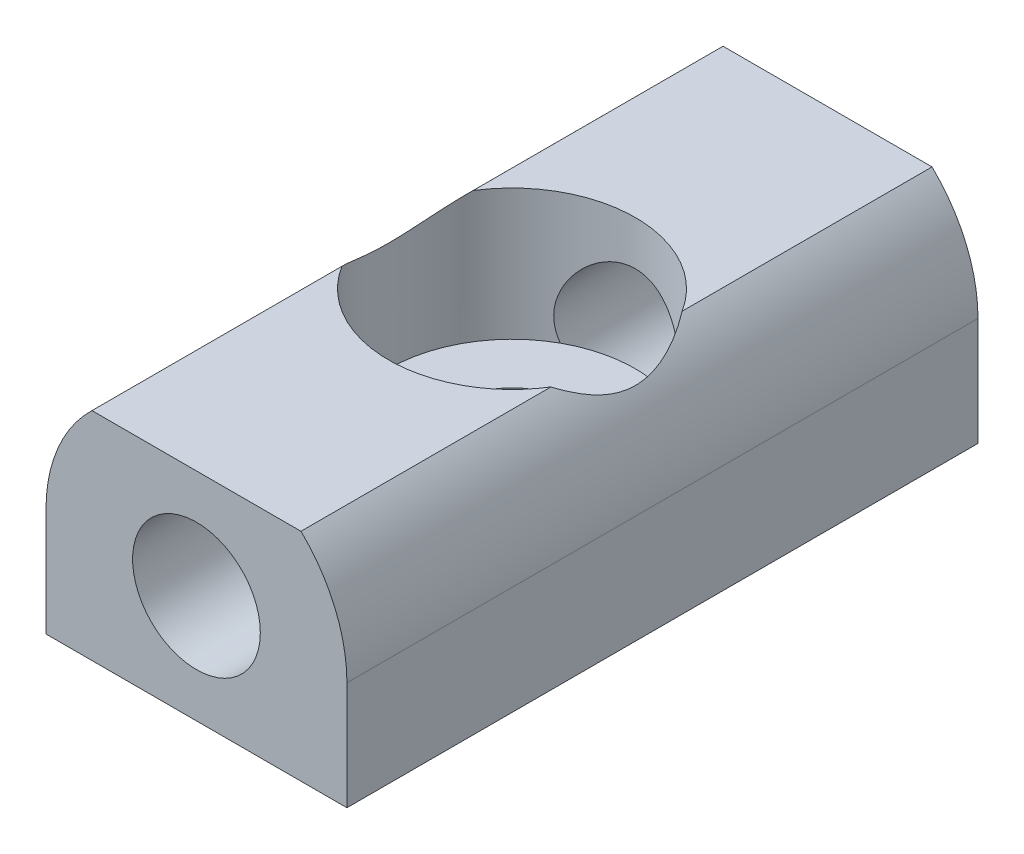
ISO-10303-21;
HEADER;
FILE_DESCRIPTION(('STEP AP214'),'2;1');
FILE_NAME('part.step','',(''),(''),'','','');
FILE_SCHEMA(('AUTOMOTIVE_DESIGN { 1 0 10303 214 1 1 1 1 }'));
ENDSEC;
DATA;
#1=APPLICATION_CONTEXT('core data for automotive mechanical design processes');
#2=APPLICATION_PROTOCOL_DEFINITION('international standard','automotive_design',2000,#1);
#3=PRODUCT_CONTEXT('',#1,'mechanical');
#4=PRODUCT('Part','Part','',(#3));
#5=PRODUCT_RELATED_PRODUCT_CATEGORY('part','',(#4));
#6=PRODUCT_DEFINITION_FORMATION('','',#4);
#7=PRODUCT_DEFINITION_CONTEXT('part definition',#1,'design');
#8=PRODUCT_DEFINITION('design','',#6,#7);
#9=PRODUCT_DEFINITION_SHAPE('','',#8);
#10=(LENGTH_UNIT() NAMED_UNIT(*) SI_UNIT(.MILLI.,.METRE.));
#11=(NAMED_UNIT(*) PLANE_ANGLE_UNIT() SI_UNIT($,.RADIAN.));
#12=(NAMED_UNIT(*) SI_UNIT($,.STERADIAN.) SOLID_ANGLE_UNIT());
#13=UNCERTAINTY_MEASURE_WITH_UNIT(LENGTH_MEASURE(1.E-05),#10,'distance_accuracy_value','');
#14=(GEOMETRIC_REPRESENTATION_CONTEXT(3) GLOBAL_UNCERTAINTY_ASSIGNED_CONTEXT((#13)) GLOBAL_UNIT_ASSIGNED_CONTEXT((#10,
#11,#12)) REPRESENTATION_CONTEXT('',''));
#15=CARTESIAN_POINT('',(0.,0.,0.));
#16=DIRECTION('',(0.,0.,1.));
#17=DIRECTION('',(1.,0.,0.));
#18=AXIS2_PLACEMENT_3D('',#15,#16,#17);
#19=CARTESIAN_POINT('',(0.,0.,14.575));
#20=DIRECTION('',(0.,0.,-1.));
#21=DIRECTION('',(-1.,0.,0.));
#22=AXIS2_PLACEMENT_3D('',#19,#20,#21);
#23=CYLINDRICAL_SURFACE('',#22,3.475);
#24=CARTESIAN_POINT('',(0.,0.,14.575));
#25=DIRECTION('',(0.,0.,1.));
#26=DIRECTION('',(1.,0.,0.));
#27=AXIS2_PLACEMENT_3D('',#24,#25,#26);
#28=CIRCLE('',#27,3.475);
#29=CARTESIAN_POINT('',(-2.41363315356746,2.5,14.575));
#30=VERTEX_POINT('',#29);
#31=CARTESIAN_POINT('',(-3.475,0.,14.575));
#32=VERTEX_POINT('',#31);
#33=EDGE_CURVE('E78',#30,#32,#28,.T.);
#34=ORIENTED_EDGE('',*,*,#33,.F.);
#35=DIRECTION('',(0.,0.,1.));
#36=VECTOR('',#35,1.);
#37=CARTESIAN_POINT('',(-2.41363315356746,2.5,0.));
#38=LINE('',#37,#36);
#39=CARTESIAN_POINT('',(-2.41363315356746,2.5,8.80304445662276));
#40=VERTEX_POINT('',#39);
#41=EDGE_CURVE('E86',#40,#30,#38,.T.);
#42=ORIENTED_EDGE('',*,*,#41,.F.);
#43=CARTESIAN_POINT('',(-2.43926218353009,2.475,8.76144029729837));
#44=CARTESIAN_POINT('',(-2.50190977369035,2.41324889261501,8.65777444071776));
#45=CARTESIAN_POINT('',(-2.55838255304536,2.35287213836801,8.5494403876258));
#46=CARTESIAN_POINT('',(-2.65815392253275,2.23953977548664,8.32289441469275));
#47=CARTESIAN_POINT('',(-2.70144008623445,2.18659119198941,8.20467331063059));
#48=CARTESIAN_POINT('',(-2.76475087189437,2.10565978747241,7.98637950962617));
#49=CARTESIAN_POINT('',(-2.78782953942763,2.07473711270727,7.88832070854308));
#50=CARTESIAN_POINT('',(-2.82364300092687,2.025735520454,7.68736716443351));
#51=CARTESIAN_POINT('',(-2.83640973198725,2.00761696929584,7.58448840474494));
#52=CARTESIAN_POINT('',(-2.85058409003645,1.98745522065405,7.37535119418737));
#53=CARTESIAN_POINT('',(-2.85188988965693,1.98555613283829,7.26907085056291));
#54=CARTESIAN_POINT('',(-2.84271445963148,1.9986603815719,7.05797465274123));
#55=CARTESIAN_POINT('',(-2.83221238178918,2.01369361420743,6.95316172070022));
#56=CARTESIAN_POINT('',(-2.79761719439963,2.06154034529333,6.73000059681824));
#57=CARTESIAN_POINT('',(-2.77142719380401,2.09705557991804,6.61258935308574));
#58=CARTESIAN_POINT('',(-2.70628208954812,2.18046717610668,6.38611715259161));
#59=CARTESIAN_POINT('',(-2.66730873016388,2.22838122345369,6.27706841460803));
#60=CARTESIAN_POINT('',(-2.59604436977691,2.31037835437774,6.10950037214036));
#61=CARTESIAN_POINT('',(-2.56736862173828,2.34227506792739,6.04829593642552));
#62=CARTESIAN_POINT('',(-2.50617327417022,2.40763784152143,5.9287870834782));
#63=CARTESIAN_POINT('',(-2.47365680258223,2.44110261129793,5.87048036054944));
#64=CARTESIAN_POINT('',(-2.39486151680196,2.51875878262914,5.74007974482753));
#65=CARTESIAN_POINT('',(-2.34733097023837,2.56323851250945,5.66890962536082));
#66=CARTESIAN_POINT('',(-2.24613569636115,2.65236921845846,5.53117348856127));
#67=CARTESIAN_POINT('',(-2.19246772004118,2.69702027302246,5.46460994004165));
#68=CARTESIAN_POINT('',(-2.02210595995551,2.82973263718651,5.27180323333249));
#69=CARTESIAN_POINT('',(-1.89612041633756,2.9164847417045,5.15255348261589));
#70=CARTESIAN_POINT('',(-1.64684453783638,3.06271532527436,4.95718473213086));
#71=CARTESIAN_POINT('',(-1.52776733977672,3.1242206566162,4.87718607247437));
#72=CARTESIAN_POINT('',(-1.27485928373556,3.23563660417618,4.73441949093708));
#73=CARTESIAN_POINT('',(-1.14105921752199,3.28557076556997,4.67161653084711));
#74=CARTESIAN_POINT('',(-0.883233161936728,3.36313393376537,4.5748937652111));
#75=CARTESIAN_POINT('',(-0.761026896837387,3.39304534428192,4.53797165891381));
#76=CARTESIAN_POINT('',(-0.510337205420337,3.43967983328066,4.4806236268406));
#77=CARTESIAN_POINT('',(-0.381856479799465,3.45640853374033,4.46019066891417));
#78=CARTESIAN_POINT('',(-0.121813978926077,3.47531680621844,4.43710590515606));
#79=CARTESIAN_POINT('',(0.00975610081333341,3.47745119255279,4.43450932269117));
#80=CARTESIAN_POINT('',(0.271382863806724,3.46686021199457,4.44742815498595));
#81=CARTESIAN_POINT('',(0.40143953205286,3.45413469786945,4.46294374920187));
#82=CARTESIAN_POINT('',(0.650016058262371,3.41587090100423,4.50987117322859));
#83=CARTESIAN_POINT('',(0.768790091574681,3.39097607006356,4.54048532678091));
#84=CARTESIAN_POINT('',(0.998971313482863,3.33044637203088,4.61556462346527));
#85=CARTESIAN_POINT('',(1.11037414022907,3.2948052139872,4.66003788029607));
#86=CARTESIAN_POINT('',(1.36159700816191,3.20084259195604,4.77871208170644));
#87=CARTESIAN_POINT('',(1.49773929795144,3.13894801350803,4.85787038736546));
#88=CARTESIAN_POINT('',(1.75186640593188,3.00454959782697,5.03417510034775));
#89=CARTESIAN_POINT('',(1.86982987629211,2.93203347937408,5.1313423656256));
#90=CARTESIAN_POINT('',(2.06797508201246,2.79480966075599,5.32244443375192));
#91=CARTESIAN_POINT('',(2.15115285802495,2.73097160112958,5.41394238267963));
#92=CARTESIAN_POINT('',(2.30479613120814,2.60260305764272,5.60655081561428));
#93=CARTESIAN_POINT('',(2.37526695235252,2.53807287583134,5.70765724660778));
#94=CARTESIAN_POINT('',(2.50197011384549,2.41319587132285,5.91733187001413));
#95=CARTESIAN_POINT('',(2.55846035436421,2.35279100920971,6.02570905346938));
#96=CARTESIAN_POINT('',(2.65820388496736,2.2394757762435,6.25224627455069));
#97=CARTESIAN_POINT('',(2.70146165682581,2.18656287116897,6.3704029826326));
#98=CARTESIAN_POINT('',(2.76474768827562,2.10566443377195,6.58860803188994));
#99=CARTESIAN_POINT('',(2.78782284158078,2.07474625164119,6.686650180331));
#100=CARTESIAN_POINT('',(2.82363887267227,2.02574119966392,6.88760125547145));
#101=CARTESIAN_POINT('',(2.83640859678508,2.0076185313392,6.9904957380986));
#102=CARTESIAN_POINT('',(2.85058461390827,1.98745452863603,7.19965563518298));
#103=CARTESIAN_POINT('',(2.85189006138037,1.98555591309574,7.30594272662161));
#104=CARTESIAN_POINT('',(2.84271311652689,1.99866227616743,7.51703864723879));
#105=CARTESIAN_POINT('',(2.83221137147234,2.01369500638849,7.62184476353867));
#106=CARTESIAN_POINT('',(2.79761988165825,2.06153663474359,7.8449821074913));
#107=CARTESIAN_POINT('',(2.77143470426432,2.09704538340722,7.96237704991149));
#108=CARTESIAN_POINT('',(2.70629329943093,2.18045339796158,8.18885140171435));
#109=CARTESIAN_POINT('',(2.66731516782178,2.22837388542062,8.29791615046933));
#110=CARTESIAN_POINT('',(2.59603239028864,2.31039209667104,8.46552797395679));
#111=CARTESIAN_POINT('',(2.567342840631,2.34230361538876,8.52675963888281));
#112=CARTESIAN_POINT('',(2.50614414942512,2.40766794041688,8.64626456696464));
#113=CARTESIAN_POINT('',(2.47364160109134,2.44111802715571,8.70454269437488));
#114=CARTESIAN_POINT('',(2.38246272344418,2.53097761395384,8.85544285334748));
#115=CARTESIAN_POINT('',(2.32054025105136,2.5881340835259,8.94567719590995));
#116=CARTESIAN_POINT('',(2.18651000179875,2.70232885743038,9.118806730169));
#117=CARTESIAN_POINT('',(2.11437511708981,2.75936642349007,9.20168140151638));
#118=CARTESIAN_POINT('',(1.97562302848502,2.85977762647954,9.34350878328268));
#119=CARTESIAN_POINT('',(1.91081322173801,2.90359249793913,9.40392073587042));
#120=CARTESIAN_POINT('',(1.774810205097,2.9886634331041,9.51920299243103));
#121=CARTESIAN_POINT('',(1.70361456007673,3.02991851044501,9.57407116527621));
#122=CARTESIAN_POINT('',(1.55509300607381,3.10875602312479,9.67755422450952));
#123=CARTESIAN_POINT('',(1.47777717122995,3.14634427553783,9.72617905544766));
#124=CARTESIAN_POINT('',(1.31725872639317,3.21685258815256,9.81649387341243));
#125=CARTESIAN_POINT('',(1.23405978812885,3.24977552216489,9.8581881323968));
#126=CARTESIAN_POINT('',(1.03194985948451,3.3205140942982,9.94713438309219));
#127=CARTESIAN_POINT('',(0.910760964149313,3.35598545051211,9.99119322921115));
#128=CARTESIAN_POINT('',(0.66074247294285,3.41401285029263,10.0628921864326));
#129=CARTESIAN_POINT('',(0.531920975405038,3.43658232146514,10.0905493686531));
#130=CARTESIAN_POINT('',(0.26932010065855,3.4670770642961,10.1278550061326));
#131=CARTESIAN_POINT('',(0.135520623651892,3.47493441862536,10.1374199420222));
#132=CARTESIAN_POINT('',(-0.132108190582186,3.4750647436083,10.1375790364937));
#133=CARTESIAN_POINT('',(-0.265937528611949,3.46733722733269,10.1281726023394));
#134=CARTESIAN_POINT('',(-0.520184225982676,3.43806577797489,10.0923647324905));
#135=CARTESIAN_POINT('',(-0.640892016746536,3.41750551949016,10.0671728093454));
#136=CARTESIAN_POINT('',(-0.875714733204624,3.36500168426022,10.0023611989993));
#137=CARTESIAN_POINT('',(-0.98982901570779,3.33305699914533,9.96274010698914));
#138=CARTESIAN_POINT('',(-1.21800863704809,3.25693795445332,9.86730874131388));
#139=CARTESIAN_POINT('',(-1.33139499143839,3.2120118778488,9.81048759770566));
#140=CARTESIAN_POINT('',(-1.54709584116062,3.11387071500706,9.68429802580414));
#141=CARTESIAN_POINT('',(-1.64939832058774,3.06064678258239,9.61491619392362));
#142=CARTESIAN_POINT('',(-1.86185287877644,2.93719653522217,9.45026539112624));
#143=CARTESIAN_POINT('',(-1.96940368730195,2.86570917922417,9.35259908581232));
#144=CARTESIAN_POINT('',(-2.16728345559199,2.71912023627006,9.14385720629286));
#145=CARTESIAN_POINT('',(-2.25763565602588,2.64402370091396,9.0328000637805));
#146=CARTESIAN_POINT('',(-2.37421574823566,2.5379067615074,8.86525672338763));
#147=CARTESIAN_POINT('',(-2.40753102357641,2.50627708920228,8.81394731103153));
#148=CARTESIAN_POINT('',(-2.43926218353009,2.475,8.76144029729837));
#149=B_SPLINE_CURVE_WITH_KNOTS('',3,(#43,#44,#45,#46,#47,#48,#49,#50,#51,#52,#53,#54,#55,#56,
#57,#58,#59,#60,#61,#62,#63,#64,#65,#66,#67,#68,#69,#70,#71,#72,#73,#74,#75,#76,#77,#78,#79,#80,
#81,#82,#83,#84,#85,#86,#87,#88,#89,#90,#91,#92,#93,#94,#95,#96,#97,#98,#99,#100,#101,#102,#103,
#104,#105,#106,#107,#108,#109,#110,#111,#112,#113,#114,#115,#116,#117,#118,#119,#120,#121,#122,
#123,#124,#125,#126,#127,#128,#129,#130,#131,#132,#133,#134,#135,#136,#137,#138,#139,#140,#141,
#142,#143,#144,#145,#146,#147,#148),.UNSPECIFIED.,.T.,.F.,(4,2,2,2,2,2,2,2,2,2,2,2,2,2,2,2,2,2,
2,2,2,2,2,2,2,2,2,2,2,2,2,2,2,2,2,2,2,2,2,2,2,2,2,2,2,2,2,2,2,2,2,2,4),(0.,0.407775414914111,
0.81593391743985,1.13096239142153,1.44501140892037,1.76184787547162,2.07924463375666,
2.45347457213725,2.82824128665926,3.05230146950828,3.2761804165901,3.56518999979718,
3.85435329213408,4.43311027500073,4.89965840516277,5.36524869314449,5.75693523197842,
6.14845463928973,6.54118568926538,6.93392063047069,7.30782894054741,7.6819565647389,
8.18685453785142,8.6923409794764,9.10892852340505,9.5253411173996,9.93337733269517,
10.3412751946614,10.65625630361,10.9703526485073,11.2872092046842,11.6045858667208,
11.9787622017012,12.3535825752655,12.5777431597902,12.8015216987775,13.1712341923253,
13.5419471218228,13.8381131408763,14.1343925816835,14.430194087024,14.725812580709,
15.1252820770723,15.5243350660447,15.9252257526493,16.3261289647632,16.6995436095788,
17.0729946193866,17.4751723564847,17.8777818170745,18.3618689991487,18.845297311351,
19.0518365714042),.UNSPECIFIED.);
#150=CARTESIAN_POINT('',(-2.41363315356746,2.5,5.77195554337723));
#151=VERTEX_POINT('',#150);
#152=EDGE_CURVE('E163',#40,#151,#149,.T.);
#153=ORIENTED_EDGE('',*,*,#152,.T.);
#154=CARTESIAN_POINT('',(-2.41363315356746,2.5,0.));
#155=VERTEX_POINT('',#154);
#156=EDGE_CURVE('E148',#155,#151,#38,.T.);
#157=ORIENTED_EDGE('',*,*,#156,.F.);
#158=CARTESIAN_POINT('',(0.,0.,0.));
#159=DIRECTION('',(0.,0.,1.));
#160=DIRECTION('',(1.,0.,0.));
#161=AXIS2_PLACEMENT_3D('',#158,#159,#160);
#162=CIRCLE('',#161,3.475);
#163=CARTESIAN_POINT('',(-3.475,0.,0.));
#164=VERTEX_POINT('',#163);
#165=EDGE_CURVE('E160',#155,#164,#162,.T.);
#166=ORIENTED_EDGE('',*,*,#165,.T.);
#167=DIRECTION('',(0.,0.,-1.));
#168=VECTOR('',#167,1.);
#169=CARTESIAN_POINT('',(-3.475,0.,19.4893921292465));
#170=LINE('',#169,#168);
#171=EDGE_CURVE('E201',#32,#164,#170,.T.);
#172=ORIENTED_EDGE('',*,*,#171,.F.);
#173=EDGE_LOOP('',(#34,#42,#153,#157,#166,#172));
#174=FACE_BOUND('',#173,.T.);
#175=ADVANCED_FACE('F67',(#174),#23,.T.);
#176=CARTESIAN_POINT('',(0.,0.,14.575));
#177=DIRECTION('',(0.,0.,1.));
#178=DIRECTION('',(1.,0.,0.));
#179=AXIS2_PLACEMENT_3D('',#176,#177,#178);
#180=PLANE('',#179);
#181=DIRECTION('',(1.,0.,0.));
#182=VECTOR('',#181,1.);
#183=CARTESIAN_POINT('',(0.,2.5,14.575));
#184=LINE('',#183,#182);
#185=CARTESIAN_POINT('',(2.41363315356746,2.5,14.575));
#186=VERTEX_POINT('',#185);
#187=EDGE_CURVE('E154',#30,#186,#184,.T.);
#188=ORIENTED_EDGE('',*,*,#187,.F.);
#189=ORIENTED_EDGE('',*,*,#33,.T.);
#190=DIRECTION('',(0.,-1.,0.));
#191=VECTOR('',#190,1.);
#192=CARTESIAN_POINT('',(-3.475,0.,14.575));
#193=LINE('',#192,#191);
#194=CARTESIAN_POINT('',(-3.475,-2.5,14.575));
#195=VERTEX_POINT('',#194);
#196=EDGE_CURVE('E198',#32,#195,#193,.T.);
#197=ORIENTED_EDGE('',*,*,#196,.T.);
#198=DIRECTION('',(1.,0.,0.));
#199=VECTOR('',#198,1.);
#200=CARTESIAN_POINT('',(0.,-2.5,14.575));
#201=LINE('',#200,#199);
#202=CARTESIAN_POINT('',(3.475,-2.5,14.575));
#203=VERTEX_POINT('',#202);
#204=EDGE_CURVE('E321',#195,#203,#201,.T.);
#205=ORIENTED_EDGE('',*,*,#204,.T.);
#206=DIRECTION('',(0.,-1.,0.));
#207=VECTOR('',#206,1.);
#208=CARTESIAN_POINT('',(3.475,0.,14.575));
#209=LINE('',#208,#207);
#210=CARTESIAN_POINT('',(3.475,0.,14.575));
#211=VERTEX_POINT('',#210);
#212=EDGE_CURVE('E186',#211,#203,#209,.T.);
#213=ORIENTED_EDGE('',*,*,#212,.F.);
#214=EDGE_CURVE('E12',#211,#186,#28,.T.);
#215=ORIENTED_EDGE('',*,*,#214,.T.);
#216=EDGE_LOOP('',(#188,#189,#197,#205,#213,#215));
#217=FACE_BOUND('',#216,.T.);
#218=CARTESIAN_POINT('',(0.,0.,14.575));
#219=DIRECTION('',(0.,0.,1.));
#220=DIRECTION('',(1.,0.,0.));
#221=AXIS2_PLACEMENT_3D('',#218,#219,#220);
#222=CIRCLE('',#221,1.475);
#223=CARTESIAN_POINT('',(1.475,0.,14.575));
#224=VERTEX_POINT('',#223);
#225=EDGE_CURVE('E174',#224,#224,#222,.T.);
#226=ORIENTED_EDGE('',*,*,#225,.F.);
#227=EDGE_LOOP('',(#226));
#228=FACE_BOUND('',#227,.T.);
#229=ADVANCED_FACE('F251',(#217,#228),#180,.T.);
#230=CARTESIAN_POINT('',(0.,0.,0.));
#231=DIRECTION('',(0.,0.,1.));
#232=DIRECTION('',(1.,0.,0.));
#233=AXIS2_PLACEMENT_3D('',#230,#231,#232);
#234=PLANE('',#233);
#235=CARTESIAN_POINT('',(0.,0.,0.));
#236=DIRECTION('',(0.,0.,-1.));
#237=DIRECTION('',(-1.,0.,0.));
#238=AXIS2_PLACEMENT_3D('',#235,#236,#237);
#239=CIRCLE('',#238,1.475);
#240=CARTESIAN_POINT('',(-1.475,0.,0.));
#241=VERTEX_POINT('',#240);
#242=EDGE_CURVE('E180',#241,#241,#239,.T.);
#243=ORIENTED_EDGE('',*,*,#242,.F.);
#244=EDGE_LOOP('',(#243));
#245=FACE_BOUND('',#244,.T.);
#246=ORIENTED_EDGE('',*,*,#165,.F.);
#247=DIRECTION('',(1.,0.,0.));
#248=VECTOR('',#247,1.);
#249=CARTESIAN_POINT('',(0.,2.5,0.));
#250=LINE('',#249,#248);
#251=CARTESIAN_POINT('',(2.41363315356746,2.5,0.));
#252=VERTEX_POINT('',#251);
#253=EDGE_CURVE('E145',#155,#252,#250,.T.);
#254=ORIENTED_EDGE('',*,*,#253,.T.);
#255=CARTESIAN_POINT('',(3.475,0.,0.));
#256=VERTEX_POINT('',#255);
#257=EDGE_CURVE('E173',#256,#252,#162,.T.);
#258=ORIENTED_EDGE('',*,*,#257,.F.);
#259=DIRECTION('',(0.,-1.,0.));
#260=VECTOR('',#259,1.);
#261=CARTESIAN_POINT('',(3.475,0.,0.));
#262=LINE('',#261,#260);
#263=CARTESIAN_POINT('',(3.475,-2.5,0.));
#264=VERTEX_POINT('',#263);
#265=EDGE_CURVE('E191',#256,#264,#262,.T.);
#266=ORIENTED_EDGE('',*,*,#265,.T.);
#267=DIRECTION('',(1.,0.,0.));
#268=VECTOR('',#267,1.);
#269=CARTESIAN_POINT('',(0.,-2.5,0.));
#270=LINE('',#269,#268);
#271=CARTESIAN_POINT('',(-3.475,-2.5,0.));
#272=VERTEX_POINT('',#271);
#273=EDGE_CURVE('E305',#272,#264,#270,.T.);
#274=ORIENTED_EDGE('',*,*,#273,.F.);
#275=DIRECTION('',(0.,-1.,0.));
#276=VECTOR('',#275,1.);
#277=CARTESIAN_POINT('',(-3.475,0.,0.));
#278=LINE('',#277,#276);
#279=EDGE_CURVE('E171',#164,#272,#278,.T.);
#280=ORIENTED_EDGE('',*,*,#279,.F.);
#281=EDGE_LOOP('',(#246,#254,#258,#266,#274,#280));
#282=FACE_BOUND('',#281,.T.);
#283=ADVANCED_FACE('F168',(#245,#282),#234,.F.);
#284=CARTESIAN_POINT('',(3.475,0.,19.4893921292465));
#285=DIRECTION('',(1.,0.,0.));
#286=DIRECTION('',(0.,0.,-1.));
#287=AXIS2_PLACEMENT_3D('',#284,#285,#286);
#288=PLANE('',#287);
#289=ORIENTED_EDGE('',*,*,#212,.T.);
#290=DIRECTION('',(0.,0.,1.));
#291=VECTOR('',#290,1.);
#292=CARTESIAN_POINT('',(3.475,-2.5,0.));
#293=LINE('',#292,#291);
#294=EDGE_CURVE('E308',#264,#203,#293,.T.);
#295=ORIENTED_EDGE('',*,*,#294,.F.);
#296=ORIENTED_EDGE('',*,*,#265,.F.);
#297=DIRECTION('',(0.,0.,-1.));
#298=VECTOR('',#297,1.);
#299=CARTESIAN_POINT('',(3.475,0.,19.4893921292465));
#300=LINE('',#299,#298);
#301=EDGE_CURVE('E187',#211,#256,#300,.T.);
#302=ORIENTED_EDGE('',*,*,#301,.F.);
#303=EDGE_LOOP('',(#289,#295,#296,#302));
#304=FACE_BOUND('',#303,.T.);
#305=ADVANCED_FACE('F250',(#304),#288,.T.);
#306=CARTESIAN_POINT('',(-3.475,0.,19.4893921292465));
#307=DIRECTION('',(1.,0.,0.));
#308=DIRECTION('',(0.,0.,-1.));
#309=AXIS2_PLACEMENT_3D('',#306,#307,#308);
#310=PLANE('',#309);
#311=DIRECTION('',(0.,0.,1.));
#312=VECTOR('',#311,1.);
#313=CARTESIAN_POINT('',(-3.475,-2.5,0.));
#314=LINE('',#313,#312);
#315=EDGE_CURVE('E312',#272,#195,#314,.T.);
#316=ORIENTED_EDGE('',*,*,#315,.T.);
#317=ORIENTED_EDGE('',*,*,#196,.F.);
#318=ORIENTED_EDGE('',*,*,#171,.T.);
#319=ORIENTED_EDGE('',*,*,#279,.T.);
#320=EDGE_LOOP('',(#316,#317,#318,#319));
#321=FACE_BOUND('',#320,.T.);
#322=ADVANCED_FACE('F231',(#321),#310,.F.);
#323=CARTESIAN_POINT('',(0.,-3.675,7.2875));
#324=DIRECTION('',(0.,1.,0.));
#325=DIRECTION('',(0.,0.,1.));
#326=AXIS2_PLACEMENT_3D('',#323,#324,#325);
#327=CYLINDRICAL_SURFACE('',#326,1.475);
#328=CARTESIAN_POINT('',(0.,-0.524999999999999,7.2875));
#329=DIRECTION('',(0.,1.,0.));
#330=DIRECTION('',(0.,0.,1.));
#331=AXIS2_PLACEMENT_3D('',#328,#329,#330);
#332=CIRCLE('',#331,1.475);
#333=CARTESIAN_POINT('',(0.,-0.524999999999999,8.7625));
#334=VERTEX_POINT('',#333);
#335=EDGE_CURVE('E327',#334,#334,#332,.T.);
#336=ORIENTED_EDGE('',*,*,#335,.T.);
#337=EDGE_LOOP('',(#336));
#338=FACE_BOUND('',#337,.T.);
#339=CARTESIAN_POINT('',(0.,-2.5,7.2875));
#340=DIRECTION('',(0.,-1.,0.));
#341=DIRECTION('',(0.,0.,-1.));
#342=AXIS2_PLACEMENT_3D('',#339,#340,#341);
#343=CIRCLE('',#342,1.475);
#344=CARTESIAN_POINT('',(0.,-2.5,5.8125));
#345=VERTEX_POINT('',#344);
#346=EDGE_CURVE('E72',#345,#345,#343,.F.);
#347=ORIENTED_EDGE('',*,*,#346,.F.);
#348=EDGE_LOOP('',(#347));
#349=FACE_BOUND('',#348,.T.);
#350=ADVANCED_FACE('F227',(#338,#349),#327,.F.);
#351=CARTESIAN_POINT('',(0.,-0.524999999999999,7.2875));
#352=DIRECTION('',(0.,1.,0.));
#353=DIRECTION('',(0.,0.,1.));
#354=AXIS2_PLACEMENT_3D('',#351,#352,#353);
#355=CYLINDRICAL_SURFACE('',#354,2.85);
#356=CARTESIAN_POINT('',(0.,-0.524999999999999,7.2875));
#357=DIRECTION('',(0.,1.,0.));
#358=DIRECTION('',(0.,0.,1.));
#359=AXIS2_PLACEMENT_3D('',#356,#357,#358);
#360=CIRCLE('',#359,2.85);
#361=CARTESIAN_POINT('',(1.37840487520902,-0.524999999999999,9.78199393665328));
#362=VERTEX_POINT('',#361);
#363=CARTESIAN_POINT('',(1.37840487520902,-0.524999999999999,4.79300606334671));
#364=VERTEX_POINT('',#363);
#365=EDGE_CURVE('E243',#362,#364,#360,.T.);
#366=ORIENTED_EDGE('',*,*,#365,.F.);
#367=CARTESIAN_POINT('',(-1.37840487520902,-0.524999999999999,9.78199393665328));
#368=CARTESIAN_POINT('',(-1.39120610171044,-0.491387645943641,9.77491848724628));
#369=CARTESIAN_POINT('',(-1.40281216807831,-0.457218100397935,9.76837877668045));
#370=CARTESIAN_POINT('',(-1.42353957474287,-0.387906641116326,9.75654403460794));
#371=CARTESIAN_POINT('',(-1.4326597388921,-0.352764275744597,9.75124959243321));
#372=CARTESIAN_POINT('',(-1.45610360420457,-0.246273763109116,9.73752089149253));
#373=CARTESIAN_POINT('',(-1.4665597145156,-0.173734176303943,9.73121324074476));
#374=CARTESIAN_POINT('',(-1.47657333078741,-0.0274322980196538,9.72517671413904));
#375=CARTESIAN_POINT('',(-1.47609797601107,0.0463330138018136,9.72546767412331));
#376=CARTESIAN_POINT('',(-1.46421110235613,0.192586484881898,9.73262381886394));
#377=CARTESIAN_POINT('',(-1.45280779924355,0.26507556193845,9.73948406474738));
#378=CARTESIAN_POINT('',(-1.42004057635239,0.405181639735204,9.75859858565373));
#379=CARTESIAN_POINT('',(-1.39891253572867,0.472872461494102,9.77072475909853));
#380=CARTESIAN_POINT('',(-1.34756716961248,0.603858350313678,9.7989573371189));
#381=CARTESIAN_POINT('',(-1.31734151869113,0.667149325391196,9.8150673850086));
#382=CARTESIAN_POINT('',(-1.24481978315489,0.795002656581178,9.85162648877151));
#383=CARTESIAN_POINT('',(-1.20156102194063,0.858937503030475,9.87235800043268));
#384=CARTESIAN_POINT('',(-1.10581149622087,0.979140859717095,9.91474637919141));
#385=CARTESIAN_POINT('',(-1.05331618478958,1.03540556981229,9.93640369804739));
#386=CARTESIAN_POINT('',(-0.933699768390189,1.14503908619848,9.98104994774634));
#387=CARTESIAN_POINT('',(-0.865603288712768,1.19739984627488,10.0039213454331));
#388=CARTESIAN_POINT('',(-0.720512791791828,1.28991512818315,10.0459517839794));
#389=CARTESIAN_POINT('',(-0.643520472444733,1.33007197400995,10.0651115313973));
#390=CARTESIAN_POINT('',(-0.48541194118221,1.39536768937491,10.0969736096196));
#391=CARTESIAN_POINT('',(-0.404536608202323,1.42098584605479,10.1098796737337));
#392=CARTESIAN_POINT('',(-0.23883253617063,1.458002895377,10.1286948324357));
#393=CARTESIAN_POINT('',(-0.154007516110922,1.46941489436886,10.134610376098));
#394=CARTESIAN_POINT('',(0.00743634501663804,1.47695523989345,10.1385117318744));
#395=CARTESIAN_POINT('',(0.083970606843846,1.47457718962386,10.1372725424481));
#396=CARTESIAN_POINT('',(0.23541205985667,1.45808281667861,10.1287725911701));
#397=CARTESIAN_POINT('',(0.310319354169887,1.4439672402436,10.1215122121296));
#398=CARTESIAN_POINT('',(0.454537123426653,1.40515507129338,10.1019386908798));
#399=CARTESIAN_POINT('',(0.523941360217845,1.38073590158877,10.0897583609547));
#400=CARTESIAN_POINT('',(0.657680794345649,1.32227521306189,10.0614203562861));
#401=CARTESIAN_POINT('',(0.722014808970924,1.28823145759489,10.0452617571506));
#402=CARTESIAN_POINT('',(0.849442378002579,1.20837760177147,10.0088393571447));
#403=CARTESIAN_POINT('',(0.912012774135297,1.16183747488339,9.98834897688272));
#404=CARTESIAN_POINT('',(1.02886006878077,1.05976388873793,9.94603649339681));
#405=CARTESIAN_POINT('',(1.08313039176891,1.00422337014989,9.92421335328243));
#406=CARTESIAN_POINT('',(1.18722435733535,0.879402146015362,9.87912446976254));
#407=CARTESIAN_POINT('',(1.23611183224171,0.809312379486984,9.85592305040718));
#408=CARTESIAN_POINT('',(1.32142205037262,0.660898640416379,9.81309505266214));
#409=CARTESIAN_POINT('',(1.35784820749357,0.582576930791982,9.79346749586921));
#410=CARTESIAN_POINT('',(1.41589764859702,0.421833584344444,9.76112427523413));
#411=CARTESIAN_POINT('',(1.43791324705023,0.339592425534116,9.74822755594376));
#412=CARTESIAN_POINT('',(1.46743955761017,0.171705077295898,9.73074277772169));
#413=CARTESIAN_POINT('',(1.47496732426374,0.0860630127058319,9.72614495003465));
#414=CARTESIAN_POINT('',(1.47502809630165,-0.0734987319772438,9.7261013905144));
#415=CARTESIAN_POINT('',(1.46946354523151,-0.147426481769298,9.72949455673837));
#416=CARTESIAN_POINT('',(1.44747539431683,-0.292990647806971,9.74259306916725));
#417=CARTESIAN_POINT('',(1.43106347543456,-0.364629442010199,9.75229162524458));
#418=CARTESIAN_POINT('',(1.40019034592903,-0.464904095810164,9.76985183594172));
#419=CARTESIAN_POINT('',(1.3897674451751,-0.495192058060572,9.7757095156113));
#420=CARTESIAN_POINT('',(1.37840487520907,-0.52499999999999,9.78199393665341));
#421=B_SPLINE_CURVE_WITH_KNOTS('',3,(#367,#368,#369,#370,#371,#372,#373,#374,#375,#376,#377,
#378,#379,#380,#381,#382,#383,#384,#385,#386,#387,#388,#389,#390,#391,#392,#393,#394,#395,#396,
#397,#398,#399,#400,#401,#402,#403,#404,#405,#406,#407,#408,#409,#410,#411,#412,#413,#414,#415,
#416,#417,#418,#419,#420),.UNSPECIFIED.,.F.,.F.,(4,2,2,2,2,2,2,2,2,2,2,2,2,2,2,2,2,2,2,2,2,2,2,
2,2,2,4),(0.,0.109918646474503,0.219889208512345,0.439415597677902,0.659601984319039,
0.879622961886805,1.09456766512261,1.3097096702705,1.54854347903302,1.7874951904212,
2.05286731370086,2.3181888703788,2.57416217724943,2.82989915223672,3.05849299056959,
3.28707229662605,3.50985462716516,3.73268877241111,3.97358366784008,4.2146684285122,
4.47904506996367,4.74334922481134,5.00012030144456,5.25658893121574,5.47813048745481,
5.69943386503551,5.79702402606481),.UNSPECIFIED.);
#422=CARTESIAN_POINT('',(-1.37840487520902,-0.524999999999999,9.78199393665328));
#423=VERTEX_POINT('',#422);
#424=EDGE_CURVE('E235',#423,#362,#421,.T.);
#425=ORIENTED_EDGE('',*,*,#424,.F.);
#426=CARTESIAN_POINT('',(-1.37840487520902,-0.524999999999999,4.79300606334671));
#427=VERTEX_POINT('',#426);
#428=EDGE_CURVE('E345',#427,#423,#360,.T.);
#429=ORIENTED_EDGE('',*,*,#428,.F.);
#430=CARTESIAN_POINT('',(1.37840487520902,-0.524999999999999,4.79300606334671));
#431=CARTESIAN_POINT('',(1.39120610171044,-0.491387645943641,4.80008151275371));
#432=CARTESIAN_POINT('',(1.40281216807831,-0.457218100397935,4.80662122331955));
#433=CARTESIAN_POINT('',(1.42353957474287,-0.387906641116326,4.81845596539205));
#434=CARTESIAN_POINT('',(1.4326597388921,-0.352764275744598,4.82375040756678));
#435=CARTESIAN_POINT('',(1.45610360420457,-0.246273763109116,4.83747910850746));
#436=CARTESIAN_POINT('',(1.4665597145156,-0.173734176303943,4.84378675925523));
#437=CARTESIAN_POINT('',(1.47657333078741,-0.0274322980196542,4.84982328586095));
#438=CARTESIAN_POINT('',(1.47609797601107,0.0463330138018134,4.84953232587668));
#439=CARTESIAN_POINT('',(1.46421110235613,0.192586484881898,4.84237618113605));
#440=CARTESIAN_POINT('',(1.45280779924355,0.26507556193845,4.83551593525261));
#441=CARTESIAN_POINT('',(1.42004057635239,0.405181639735204,4.81640141434626));
#442=CARTESIAN_POINT('',(1.39891253572867,0.472872461494103,4.80427524090146));
#443=CARTESIAN_POINT('',(1.34756716961248,0.603858350313678,4.77604266288109));
#444=CARTESIAN_POINT('',(1.31734151869113,0.667149325391196,4.7599326149914));
#445=CARTESIAN_POINT('',(1.24481978315489,0.795002656581178,4.72337351122848));
#446=CARTESIAN_POINT('',(1.20156102194063,0.858937503030475,4.70264199956732));
#447=CARTESIAN_POINT('',(1.10581149622087,0.979140859717096,4.66025362080858));
#448=CARTESIAN_POINT('',(1.05331618478958,1.03540556981229,4.6385963019526));
#449=CARTESIAN_POINT('',(0.933699768390189,1.14503908619848,4.59395005225366));
#450=CARTESIAN_POINT('',(0.865603288712768,1.19739984627488,4.57107865456691));
#451=CARTESIAN_POINT('',(0.720512791791828,1.28991512818315,4.52904821602063));
#452=CARTESIAN_POINT('',(0.643520472444732,1.33007197400995,4.50988846860273));
#453=CARTESIAN_POINT('',(0.485411941182209,1.39536768937491,4.47802639038042));
#454=CARTESIAN_POINT('',(0.404536608202323,1.42098584605479,4.46512032626634));
#455=CARTESIAN_POINT('',(0.23883253617063,1.458002895377,4.44630516756432));
#456=CARTESIAN_POINT('',(0.154007516110921,1.46941489436886,4.44038962390195));
#457=CARTESIAN_POINT('',(-0.00743634501663816,1.47695523989345,4.43648826812557));
#458=CARTESIAN_POINT('',(-0.0839706068438461,1.47457718962386,4.43772745755185));
#459=CARTESIAN_POINT('',(-0.23541205985667,1.45808281667861,4.44622740882992));
#460=CARTESIAN_POINT('',(-0.310319354169887,1.4439672402436,4.45348778787043));
#461=CARTESIAN_POINT('',(-0.454537123426653,1.40515507129338,4.47306130912022));
#462=CARTESIAN_POINT('',(-0.523941360217846,1.38073590158877,4.48524163904529));
#463=CARTESIAN_POINT('',(-0.65768079434565,1.32227521306189,4.51357964371394));
#464=CARTESIAN_POINT('',(-0.722014808970924,1.28823145759489,4.52973824284936));
#465=CARTESIAN_POINT('',(-0.849442378002579,1.20837760177147,4.5661606428553));
#466=CARTESIAN_POINT('',(-0.912012774135298,1.16183747488339,4.58665102311727));
#467=CARTESIAN_POINT('',(-1.02886006878077,1.05976388873793,4.62896350660319));
#468=CARTESIAN_POINT('',(-1.08313039176891,1.00422337014989,4.65078664671756));
#469=CARTESIAN_POINT('',(-1.18722435733536,0.879402146015361,4.69587553023745));
#470=CARTESIAN_POINT('',(-1.23611183224171,0.809312379486983,4.71907694959282));
#471=CARTESIAN_POINT('',(-1.32142205037262,0.660898640416378,4.76190494733785));
#472=CARTESIAN_POINT('',(-1.35784820749357,0.582576930791981,4.78153250413079));
#473=CARTESIAN_POINT('',(-1.41589764859702,0.421833584344443,4.81387572476586));
#474=CARTESIAN_POINT('',(-1.43791324705023,0.339592425534115,4.82677244405623));
#475=CARTESIAN_POINT('',(-1.46743955761017,0.171705077295897,4.84425722227831));
#476=CARTESIAN_POINT('',(-1.47496732426374,0.0860630127058312,4.84885504996535));
#477=CARTESIAN_POINT('',(-1.47502809630165,-0.0734987319772445,4.84889860948559));
#478=CARTESIAN_POINT('',(-1.46946354523151,-0.147426481769298,4.84550544326162));
#479=CARTESIAN_POINT('',(-1.44747539431683,-0.292990647806972,4.83240693083274));
#480=CARTESIAN_POINT('',(-1.43106347543456,-0.364629442010199,4.82270837475541));
#481=CARTESIAN_POINT('',(-1.40019034592903,-0.464904095810164,4.80514816405827));
#482=CARTESIAN_POINT('',(-1.3897674451751,-0.495192058060572,4.7992904843887));
#483=CARTESIAN_POINT('',(-1.37840487520907,-0.52499999999999,4.79300606334659));
#484=B_SPLINE_CURVE_WITH_KNOTS('',3,(#430,#431,#432,#433,#434,#435,#436,#437,#438,#439,#440,
#441,#442,#443,#444,#445,#446,#447,#448,#449,#450,#451,#452,#453,#454,#455,#456,#457,#458,#459,
#460,#461,#462,#463,#464,#465,#466,#467,#468,#469,#470,#471,#472,#473,#474,#475,#476,#477,#478,
#479,#480,#481,#482,#483),.UNSPECIFIED.,.F.,.F.,(4,2,2,2,2,2,2,2,2,2,2,2,2,2,2,2,2,2,2,2,2,2,2,
2,2,2,4),(0.,0.109918646474503,0.219889208512345,0.439415597677902,0.659601984319038,
0.879622961886805,1.09456766512261,1.3097096702705,1.54854347903302,1.7874951904212,
2.05286731370086,2.3181888703788,2.57416217724943,2.82989915223672,3.05849299056959,
3.28707229662605,3.50985462716516,3.73268877241111,3.97358366784009,4.2146684285122,
4.47904506996367,4.74334922481134,5.00012030144456,5.25658893121574,5.47813048745481,
5.69943386503551,5.79702402606481),.UNSPECIFIED.);
#485=EDGE_CURVE('E214',#364,#427,#484,.T.);
#486=ORIENTED_EDGE('',*,*,#485,.F.);
#487=EDGE_LOOP('',(#366,#425,#429,#486));
#488=FACE_BOUND('',#487,.T.);
#489=ORIENTED_EDGE('',*,*,#152,.F.);
#490=CARTESIAN_POINT('',(0.,2.5,7.2875));
#491=DIRECTION('',(0.,-1.,0.));
#492=DIRECTION('',(0.,0.,-1.));
#493=AXIS2_PLACEMENT_3D('',#490,#491,#492);
#494=CIRCLE('',#493,2.85);
#495=CARTESIAN_POINT('',(2.41363315356746,2.5,8.80304445662276));
#496=VERTEX_POINT('',#495);
#497=EDGE_CURVE('E326',#40,#496,#494,.F.);
#498=ORIENTED_EDGE('',*,*,#497,.T.);
#499=CARTESIAN_POINT('',(2.41363315356746,2.5,5.77195554337723));
#500=VERTEX_POINT('',#499);
#501=EDGE_CURVE('E207',#500,#496,#149,.T.);
#502=ORIENTED_EDGE('',*,*,#501,.F.);
#503=EDGE_CURVE('E324',#500,#151,#494,.F.);
#504=ORIENTED_EDGE('',*,*,#503,.T.);
#505=EDGE_LOOP('',(#489,#498,#502,#504));
#506=FACE_BOUND('',#505,.T.);
#507=ADVANCED_FACE('F221',(#488,#506),#355,.F.);
#508=CARTESIAN_POINT('',(0.,0.,4.575));
#509=DIRECTION('',(0.,0.,1.));
#510=DIRECTION('',(1.,0.,0.));
#511=AXIS2_PLACEMENT_3D('',#508,#509,#510);
#512=CYLINDRICAL_SURFACE('',#511,1.475);
#513=ORIENTED_EDGE('',*,*,#225,.T.);
#514=EDGE_LOOP('',(#513));
#515=FACE_BOUND('',#514,.T.);
#516=ORIENTED_EDGE('',*,*,#424,.T.);
#517=CARTESIAN_POINT('',(1.37840487520902,-0.524999999999998,9.78199393665328));
#518=CARTESIAN_POINT('',(1.34798812608564,-0.604845451598772,9.7987973347113));
#519=CARTESIAN_POINT('',(1.31092304703274,-0.681328864789426,9.81856698029583));
#520=CARTESIAN_POINT('',(1.22480634600066,-0.826177834176159,9.86134011528105));
#521=CARTESIAN_POINT('',(1.17576242581973,-0.894548564622136,9.88434152279962));
#522=CARTESIAN_POINT('',(1.06704664967923,-1.02177798828927,9.93086910895186));
#523=CARTESIAN_POINT('',(1.00739266728738,-1.08065236572756,9.95439434773045));
#524=CARTESIAN_POINT('',(0.878529683469624,-1.18778253220332,9.99957366704198));
#525=CARTESIAN_POINT('',(0.809318475445646,-1.23603586233153,10.021227313574));
#526=CARTESIAN_POINT('',(0.661611804009268,-1.32108472256474,10.0607106087929));
#527=CARTESIAN_POINT('',(0.58298884908501,-1.35769067625786,10.0784756486958));
#528=CARTESIAN_POINT('',(0.419508128400704,-1.41674617588725,10.107673953902));
#529=CARTESIAN_POINT('',(0.334656633660735,-1.43920974816877,10.1191134914326));
#530=CARTESIAN_POINT('',(0.170313943146943,-1.46726246886978,10.1334809248052));
#531=CARTESIAN_POINT('',(0.0911360701365714,-1.47431531676012,10.1371460382145));
#532=CARTESIAN_POINT('',(-0.067341061146582,-1.47558871583652,10.1378042951584));
#533=CARTESIAN_POINT('',(-0.146640273037106,-1.4698133301609,10.1347995512641));
#534=CARTESIAN_POINT('',(-0.297576173620341,-1.44655395412475,10.1228668140094));
#535=CARTESIAN_POINT('',(-0.36937199805499,-1.42987300354684,10.1143454355493));
#536=CARTESIAN_POINT('',(-0.509019514361966,-1.38631739329112,10.0925661717159));
#537=CARTESIAN_POINT('',(-0.576871020895868,-1.35944225504733,10.0793080639786));
#538=CARTESIAN_POINT('',(-0.710361938665744,-1.29490205187533,10.0484427799103));
#539=CARTESIAN_POINT('',(-0.775738048319398,-1.25678024716947,10.0306571163574));
#540=CARTESIAN_POINT('',(-0.899492085776381,-1.17140920431769,9.99260903145751));
#541=CARTESIAN_POINT('',(-0.957862398700619,-1.12415017760341,9.97234396258751));
#542=CARTESIAN_POINT('',(-1.07247386409506,-1.0160132574279,9.92879658372474));
#543=CARTESIAN_POINT('',(-1.12781709200918,-0.95421877776237,9.90542360843357));
#544=CARTESIAN_POINT('',(-1.22751770359296,-0.821984494977269,9.86018309879202));
#545=CARTESIAN_POINT('',(-1.27189659266032,-0.751562027412154,9.83831267918527));
#546=CARTESIAN_POINT('',(-1.33569009467842,-0.628206810280007,9.80528710797485));
#547=CARTESIAN_POINT('',(-1.35848989239355,-0.5773020871346,9.7929946206643));
#548=CARTESIAN_POINT('',(-1.37840487520902,-0.524999999999997,9.78199393665328));
#549=B_SPLINE_CURVE_WITH_KNOTS('',3,(#517,#518,#519,#520,#521,#522,#523,#524,#525,#526,#527,
#528,#529,#530,#531,#532,#533,#534,#535,#536,#537,#538,#539,#540,#541,#542,#543,#544,#545,#546,
#547,#548),.UNSPECIFIED.,.F.,.F.,(4,2,2,2,2,2,2,2,2,2,2,2,2,2,2,4),(0.,0.260616613274179,
0.521066102109041,0.781080926617303,1.0411558847391,1.30526978680645,1.56912132761041,
1.80656868631142,2.04394084807453,2.26554912018406,2.48716779697816,2.71944424939031,
2.95197092879608,3.2094069367691,3.4663339293359,3.63732968909446),.UNSPECIFIED.);
#550=EDGE_CURVE('E263',#362,#423,#549,.T.);
#551=ORIENTED_EDGE('',*,*,#550,.T.);
#552=EDGE_LOOP('',(#516,#551));
#553=FACE_BOUND('',#552,.T.);
#554=ADVANCED_FACE('F226',(#515,#553),#512,.F.);
#555=ORIENTED_EDGE('',*,*,#242,.T.);
#556=EDGE_LOOP('',(#555));
#557=FACE_BOUND('',#556,.T.);
#558=ORIENTED_EDGE('',*,*,#485,.T.);
#559=CARTESIAN_POINT('',(-1.37840487520902,-0.524999999999998,4.79300606334671));
#560=CARTESIAN_POINT('',(-1.34798812608564,-0.604845451598772,4.77620266528869));
#561=CARTESIAN_POINT('',(-1.31092304703274,-0.681328864789426,4.75643301970417));
#562=CARTESIAN_POINT('',(-1.22480634600066,-0.826177834176159,4.71365988471894));
#563=CARTESIAN_POINT('',(-1.17576242581973,-0.894548564622136,4.69065847720037));
#564=CARTESIAN_POINT('',(-1.06704664967923,-1.02177798828927,4.64413089104814));
#565=CARTESIAN_POINT('',(-1.00739266728738,-1.08065236572756,4.62060565226954));
#566=CARTESIAN_POINT('',(-0.878529683469624,-1.18778253220332,4.57542633295802));
#567=CARTESIAN_POINT('',(-0.809318475445647,-1.23603586233152,4.55377268642603));
#568=CARTESIAN_POINT('',(-0.661611804009269,-1.32108472256474,4.51428939120711));
#569=CARTESIAN_POINT('',(-0.58298884908501,-1.35769067625786,4.49652435130422));
#570=CARTESIAN_POINT('',(-0.419508128400705,-1.41674617588725,4.46732604609804));
#571=CARTESIAN_POINT('',(-0.334656633660736,-1.43920974816877,4.45588650856735));
#572=CARTESIAN_POINT('',(-0.170313943146944,-1.46726246886978,4.44151907519476));
#573=CARTESIAN_POINT('',(-0.0911360701365722,-1.47431531676012,4.43785396178549));
#574=CARTESIAN_POINT('',(0.0673410611465813,-1.47558871583652,4.43719570484161));
#575=CARTESIAN_POINT('',(0.146640273037105,-1.4698133301609,4.44020044873591));
#576=CARTESIAN_POINT('',(0.297576173620341,-1.44655395412475,4.45213318599056));
#577=CARTESIAN_POINT('',(0.36937199805499,-1.42987300354684,4.46065456445068));
#578=CARTESIAN_POINT('',(0.509019514361966,-1.38631739329112,4.48243382828412));
#579=CARTESIAN_POINT('',(0.576871020895868,-1.35944225504733,4.49569193602142));
#580=CARTESIAN_POINT('',(0.710361938665744,-1.29490205187533,4.52655722008967));
#581=CARTESIAN_POINT('',(0.775738048319398,-1.25678024716947,4.54434288364261));
#582=CARTESIAN_POINT('',(0.899492085776381,-1.17140920431769,4.58239096854248));
#583=CARTESIAN_POINT('',(0.957862398700619,-1.12415017760341,4.60265603741249));
#584=CARTESIAN_POINT('',(1.07247386409506,-1.0160132574279,4.64620341627525));
#585=CARTESIAN_POINT('',(1.12781709200918,-0.95421877776237,4.66957639156642));
#586=CARTESIAN_POINT('',(1.22751770359296,-0.82198449497727,4.71481690120797));
#587=CARTESIAN_POINT('',(1.27189659266032,-0.751562027412155,4.73668732081472));
#588=CARTESIAN_POINT('',(1.33569009467842,-0.628206810280008,4.76971289202514));
#589=CARTESIAN_POINT('',(1.35848989239355,-0.577302087134601,4.78200537933569));
#590=CARTESIAN_POINT('',(1.37840487520902,-0.524999999999998,4.79300606334671));
#591=B_SPLINE_CURVE_WITH_KNOTS('',3,(#559,#560,#561,#562,#563,#564,#565,#566,#567,#568,#569,
#570,#571,#572,#573,#574,#575,#576,#577,#578,#579,#580,#581,#582,#583,#584,#585,#586,#587,#588,
#589,#590),.UNSPECIFIED.,.F.,.F.,(4,2,2,2,2,2,2,2,2,2,2,2,2,2,2,4),(0.,0.260616613274179,
0.521066102109041,0.781080926617302,1.0411558847391,1.30526978680645,1.56912132761041,
1.80656868631142,2.04394084807453,2.26554912018406,2.48716779697816,2.71944424939031,
2.95197092879608,3.2094069367691,3.4663339293359,3.63732968909446),.UNSPECIFIED.);
#592=EDGE_CURVE('E256',#427,#364,#591,.T.);
#593=ORIENTED_EDGE('',*,*,#592,.T.);
#594=EDGE_LOOP('',(#558,#593));
#595=FACE_BOUND('',#594,.T.);
#596=ADVANCED_FACE('F245',(#557,#595),#512,.F.);
#597=ORIENTED_EDGE('',*,*,#257,.T.);
#598=DIRECTION('',(0.,0.,1.));
#599=VECTOR('',#598,1.);
#600=CARTESIAN_POINT('',(2.41363315356746,2.5,0.));
#601=LINE('',#600,#599);
#602=EDGE_CURVE('E94',#252,#500,#601,.T.);
#603=ORIENTED_EDGE('',*,*,#602,.T.);
#604=ORIENTED_EDGE('',*,*,#501,.T.);
#605=EDGE_CURVE('E165',#496,#186,#601,.T.);
#606=ORIENTED_EDGE('',*,*,#605,.T.);
#607=ORIENTED_EDGE('',*,*,#214,.F.);
#608=ORIENTED_EDGE('',*,*,#301,.T.);
#609=EDGE_LOOP('',(#597,#603,#604,#606,#607,#608));
#610=FACE_BOUND('',#609,.T.);
#611=ADVANCED_FACE('F69',(#610),#23,.T.);
#612=CARTESIAN_POINT('',(0.,-0.524999999999999,0.));
#613=DIRECTION('',(0.,1.,0.));
#614=DIRECTION('',(0.,0.,1.));
#615=AXIS2_PLACEMENT_3D('',#612,#613,#614);
#616=PLANE('',#615);
#617=ORIENTED_EDGE('',*,*,#335,.F.);
#618=EDGE_LOOP('',(#617));
#619=FACE_BOUND('',#618,.T.);
#620=CARTESIAN_POINT('',(0.,-0.524999999999999,7.2875));
#621=DIRECTION('',(0.,1.,0.));
#622=DIRECTION('',(0.,0.,1.));
#623=AXIS2_PLACEMENT_3D('',#620,#621,#622);
#624=CIRCLE('',#623,2.85);
#625=EDGE_CURVE('E265',#423,#362,#624,.T.);
#626=ORIENTED_EDGE('',*,*,#625,.T.);
#627=ORIENTED_EDGE('',*,*,#365,.T.);
#628=EDGE_CURVE('E264',#364,#427,#624,.T.);
#629=ORIENTED_EDGE('',*,*,#628,.T.);
#630=ORIENTED_EDGE('',*,*,#428,.T.);
#631=EDGE_LOOP('',(#626,#627,#629,#630));
#632=FACE_BOUND('',#631,.T.);
#633=ADVANCED_FACE('F229',(#619,#632),#616,.T.);
#634=CARTESIAN_POINT('',(0.,-11.7360173055266,7.2875));
#635=DIRECTION('',(0.,1.,0.));
#636=DIRECTION('',(0.,0.,1.));
#637=AXIS2_PLACEMENT_3D('',#634,#635,#636);
#638=CYLINDRICAL_SURFACE('',#637,2.85);
#639=ORIENTED_EDGE('',*,*,#592,.F.);
#640=ORIENTED_EDGE('',*,*,#628,.F.);
#641=EDGE_LOOP('',(#639,#640));
#642=FACE_BOUND('',#641,.T.);
#643=ADVANCED_FACE('F276',(#642),#638,.T.);
#644=ORIENTED_EDGE('',*,*,#550,.F.);
#645=ORIENTED_EDGE('',*,*,#625,.F.);
#646=EDGE_LOOP('',(#644,#645));
#647=FACE_BOUND('',#646,.T.);
#648=ADVANCED_FACE('F271',(#647),#638,.T.);
#649=CARTESIAN_POINT('',(0.,-2.5,0.));
#650=DIRECTION('',(0.,-1.,0.));
#651=DIRECTION('',(0.,0.,-1.));
#652=AXIS2_PLACEMENT_3D('',#649,#650,#651);
#653=PLANE('',#652);
#654=ORIENTED_EDGE('',*,*,#204,.F.);
#655=ORIENTED_EDGE('',*,*,#315,.F.);
#656=ORIENTED_EDGE('',*,*,#273,.T.);
#657=ORIENTED_EDGE('',*,*,#294,.T.);
#658=EDGE_LOOP('',(#654,#655,#656,#657));
#659=FACE_BOUND('',#658,.T.);
#660=ORIENTED_EDGE('',*,*,#346,.T.);
#661=EDGE_LOOP('',(#660));
#662=FACE_BOUND('',#661,.T.);
#663=ADVANCED_FACE('F275',(#659,#662),#653,.T.);
#664=CARTESIAN_POINT('',(0.,2.5,0.));
#665=DIRECTION('',(0.,-1.,0.));
#666=DIRECTION('',(0.,0.,-1.));
#667=AXIS2_PLACEMENT_3D('',#664,#665,#666);
#668=PLANE('',#667);
#669=ORIENTED_EDGE('',*,*,#602,.F.);
#670=ORIENTED_EDGE('',*,*,#253,.F.);
#671=ORIENTED_EDGE('',*,*,#156,.T.);
#672=ORIENTED_EDGE('',*,*,#503,.F.);
#673=EDGE_LOOP('',(#669,#670,#671,#672));
#674=FACE_BOUND('',#673,.T.);
#675=ADVANCED_FACE('F147',(#674),#668,.F.);
#676=ORIENTED_EDGE('',*,*,#41,.T.);
#677=ORIENTED_EDGE('',*,*,#187,.T.);
#678=ORIENTED_EDGE('',*,*,#605,.F.);
#679=ORIENTED_EDGE('',*,*,#497,.F.);
#680=EDGE_LOOP('',(#676,#677,#678,#679));
#681=FACE_BOUND('',#680,.T.);
#682=ADVANCED_FACE('F285',(#681),#668,.F.);
#683=CLOSED_SHELL('',(#175,#229,#283,#305,#322,#350,#507,#554,#596,#611,#633,#643,#648,#663,
#675,#682));
#684=MANIFOLD_SOLID_BREP('B2',#683);
#685=ADVANCED_BREP_SHAPE_REPRESENTATION('',(#18,#684),#14);
#686=SHAPE_DEFINITION_REPRESENTATION(#9,#685);
ENDSEC;
END-ISO-10303-21;
